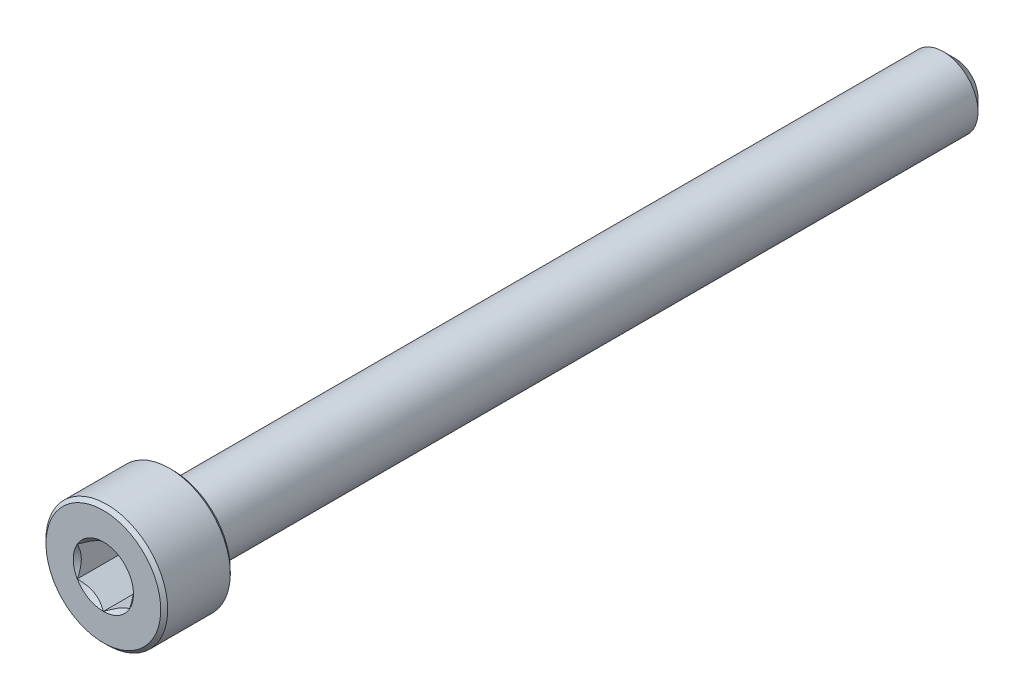
ISO-10303-21;
HEADER;
FILE_DESCRIPTION(('STEP AP214'),'2;1');
FILE_NAME('part.step','',(''),(''),'','','');
FILE_SCHEMA(('AUTOMOTIVE_DESIGN { 1 0 10303 214 1 1 1 1 }'));
ENDSEC;
DATA;
#1=APPLICATION_CONTEXT('core data for automotive mechanical design processes');
#2=APPLICATION_PROTOCOL_DEFINITION('international standard','automotive_design',2000,#1);
#3=PRODUCT_CONTEXT('',#1,'mechanical');
#4=PRODUCT('Part','Part','',(#3));
#5=PRODUCT_RELATED_PRODUCT_CATEGORY('part','',(#4));
#6=PRODUCT_DEFINITION_FORMATION('','',#4);
#7=PRODUCT_DEFINITION_CONTEXT('part definition',#1,'design');
#8=PRODUCT_DEFINITION('design','',#6,#7);
#9=PRODUCT_DEFINITION_SHAPE('','',#8);
#10=(LENGTH_UNIT() NAMED_UNIT(*) SI_UNIT(.MILLI.,.METRE.));
#11=(NAMED_UNIT(*) PLANE_ANGLE_UNIT() SI_UNIT($,.RADIAN.));
#12=(NAMED_UNIT(*) SI_UNIT($,.STERADIAN.) SOLID_ANGLE_UNIT());
#13=UNCERTAINTY_MEASURE_WITH_UNIT(LENGTH_MEASURE(1.E-05),#10,'distance_accuracy_value','');
#14=(GEOMETRIC_REPRESENTATION_CONTEXT(3) GLOBAL_UNCERTAINTY_ASSIGNED_CONTEXT((#13)) GLOBAL_UNIT_ASSIGNED_CONTEXT((#10,
#11,#12)) REPRESENTATION_CONTEXT('',''));
#15=CARTESIAN_POINT('',(0.,0.,0.));
#16=DIRECTION('',(0.,0.,1.));
#17=DIRECTION('',(1.,0.,0.));
#18=AXIS2_PLACEMENT_3D('',#15,#16,#17);
#19=CARTESIAN_POINT('',(0.,0.,24.5));
#20=DIRECTION('',(0.,0.,1.));
#21=DIRECTION('',(0.,-1.,0.));
#22=AXIS2_PLACEMENT_3D('',#19,#20,#21);
#23=PLANE('',#22);
#24=CARTESIAN_POINT('',(0.,0.,24.5));
#25=DIRECTION('',(0.,0.,1.));
#26=DIRECTION('',(1.,0.,0.));
#27=AXIS2_PLACEMENT_3D('',#24,#25,#26);
#28=CIRCLE('',#27,1.73205080756888);
#29=CARTESIAN_POINT('',(0.,-1.73205080756888,24.5));
#30=VERTEX_POINT('',#29);
#31=CARTESIAN_POINT('',(1.5,-0.866025403784438,24.5));
#32=VERTEX_POINT('',#31);
#33=EDGE_CURVE('E106',#30,#32,#28,.T.);
#34=ORIENTED_EDGE('',*,*,#33,.F.);
#35=CARTESIAN_POINT('',(-1.5,-0.866025403784439,24.5));
#36=VERTEX_POINT('',#35);
#37=EDGE_CURVE('E300',#36,#30,#28,.T.);
#38=ORIENTED_EDGE('',*,*,#37,.F.);
#39=CARTESIAN_POINT('',(-1.5,0.86602540378444,24.5));
#40=VERTEX_POINT('',#39);
#41=EDGE_CURVE('E147',#40,#36,#28,.T.);
#42=ORIENTED_EDGE('',*,*,#41,.F.);
#43=CARTESIAN_POINT('',(0.,1.73205080756888,24.5));
#44=VERTEX_POINT('',#43);
#45=EDGE_CURVE('E140',#44,#40,#28,.T.);
#46=ORIENTED_EDGE('',*,*,#45,.F.);
#47=CARTESIAN_POINT('',(1.5,0.86602540378444,24.5));
#48=VERTEX_POINT('',#47);
#49=EDGE_CURVE('E108',#48,#44,#28,.T.);
#50=ORIENTED_EDGE('',*,*,#49,.F.);
#51=EDGE_CURVE('E99',#32,#48,#28,.T.);
#52=ORIENTED_EDGE('',*,*,#51,.F.);
#53=EDGE_LOOP('',(#34,#38,#42,#46,#50,#52));
#54=FACE_BOUND('',#53,.T.);
#55=CARTESIAN_POINT('',(0.,0.,24.5));
#56=DIRECTION('',(0.,0.,-1.));
#57=DIRECTION('',(0.,1.,0.));
#58=AXIS2_PLACEMENT_3D('',#55,#56,#57);
#59=CIRCLE('',#58,3.3);
#60=CARTESIAN_POINT('',(0.,3.3,24.5));
#61=VERTEX_POINT('',#60);
#62=EDGE_CURVE('E55',#61,#61,#59,.T.);
#63=ORIENTED_EDGE('',*,*,#62,.F.);
#64=EDGE_LOOP('',(#63));
#65=FACE_BOUND('',#64,.T.);
#66=ADVANCED_FACE('F41',(#54,#65),#23,.T.);
#67=CARTESIAN_POINT('',(0.,0.,24.3));
#68=DIRECTION('',(0.,0.,-1.));
#69=DIRECTION('',(0.,1.,0.));
#70=AXIS2_PLACEMENT_3D('',#67,#68,#69);
#71=CONICAL_SURFACE('',#70,3.5,0.785398163397452);
#72=ORIENTED_EDGE('',*,*,#62,.T.);
#73=EDGE_LOOP('',(#72));
#74=FACE_BOUND('',#73,.T.);
#75=CARTESIAN_POINT('',(0.,0.,24.3));
#76=DIRECTION('',(0.,0.,-1.));
#77=DIRECTION('',(0.,1.,0.));
#78=AXIS2_PLACEMENT_3D('',#75,#76,#77);
#79=CIRCLE('',#78,3.5);
#80=CARTESIAN_POINT('',(0.,3.5,24.3));
#81=VERTEX_POINT('',#80);
#82=EDGE_CURVE('E233',#81,#81,#79,.T.);
#83=ORIENTED_EDGE('',*,*,#82,.F.);
#84=EDGE_LOOP('',(#83));
#85=FACE_BOUND('',#84,.T.);
#86=ADVANCED_FACE('F221',(#74,#85),#71,.T.);
#87=CARTESIAN_POINT('',(0.,0.,-24.5));
#88=DIRECTION('',(0.,0.,-1.));
#89=DIRECTION('',(0.,1.,0.));
#90=AXIS2_PLACEMENT_3D('',#87,#88,#89);
#91=CYLINDRICAL_SURFACE('',#90,3.5);
#92=ORIENTED_EDGE('',*,*,#82,.T.);
#93=EDGE_LOOP('',(#92));
#94=FACE_BOUND('',#93,.T.);
#95=CARTESIAN_POINT('',(0.,0.,20.7));
#96=DIRECTION('',(0.,0.,-1.));
#97=DIRECTION('',(0.,1.,0.));
#98=AXIS2_PLACEMENT_3D('',#95,#96,#97);
#99=CIRCLE('',#98,3.5);
#100=CARTESIAN_POINT('',(0.,3.5,20.7));
#101=VERTEX_POINT('',#100);
#102=EDGE_CURVE('E235',#101,#101,#99,.T.);
#103=ORIENTED_EDGE('',*,*,#102,.F.);
#104=EDGE_LOOP('',(#103));
#105=FACE_BOUND('',#104,.T.);
#106=ADVANCED_FACE('F218',(#94,#105),#91,.T.);
#107=CARTESIAN_POINT('',(0.,0.,20.5));
#108=DIRECTION('',(0.,0.,1.));
#109=DIRECTION('',(0.,-1.,0.));
#110=AXIS2_PLACEMENT_3D('',#107,#108,#109);
#111=CONICAL_SURFACE('',#110,3.3,0.785398163397434);
#112=ORIENTED_EDGE('',*,*,#102,.T.);
#113=EDGE_LOOP('',(#112));
#114=FACE_BOUND('',#113,.T.);
#115=CARTESIAN_POINT('',(0.,0.,20.5));
#116=DIRECTION('',(0.,0.,-1.));
#117=DIRECTION('',(0.,1.,0.));
#118=AXIS2_PLACEMENT_3D('',#115,#116,#117);
#119=CIRCLE('',#118,3.3);
#120=CARTESIAN_POINT('',(0.,3.3,20.5));
#121=VERTEX_POINT('',#120);
#122=EDGE_CURVE('E240',#121,#121,#119,.T.);
#123=ORIENTED_EDGE('',*,*,#122,.F.);
#124=EDGE_LOOP('',(#123));
#125=FACE_BOUND('',#124,.T.);
#126=ADVANCED_FACE('F214',(#114,#125),#111,.T.);
#127=CARTESIAN_POINT('',(0.,3.3,20.5));
#128=DIRECTION('',(0.,0.,-1.));
#129=DIRECTION('',(0.,1.,0.));
#130=AXIS2_PLACEMENT_3D('',#127,#128,#129);
#131=PLANE('',#130);
#132=ORIENTED_EDGE('',*,*,#122,.T.);
#133=EDGE_LOOP('',(#132));
#134=FACE_BOUND('',#133,.T.);
#135=CARTESIAN_POINT('',(0.,0.,20.5));
#136=DIRECTION('',(0.,0.,-1.));
#137=DIRECTION('',(0.,1.,0.));
#138=AXIS2_PLACEMENT_3D('',#135,#136,#137);
#139=CIRCLE('',#138,2.);
#140=CARTESIAN_POINT('',(0.,2.,20.5));
#141=VERTEX_POINT('',#140);
#142=EDGE_CURVE('E246',#141,#141,#139,.T.);
#143=ORIENTED_EDGE('',*,*,#142,.F.);
#144=EDGE_LOOP('',(#143));
#145=FACE_BOUND('',#144,.T.);
#146=ADVANCED_FACE('F210',(#134,#145),#131,.T.);
#147=CARTESIAN_POINT('',(0.,0.,-24.5));
#148=DIRECTION('',(0.,0.,-1.));
#149=DIRECTION('',(0.,1.,0.));
#150=AXIS2_PLACEMENT_3D('',#147,#148,#149);
#151=CYLINDRICAL_SURFACE('',#150,2.);
#152=ORIENTED_EDGE('',*,*,#142,.T.);
#153=EDGE_LOOP('',(#152));
#154=FACE_BOUND('',#153,.T.);
#155=CARTESIAN_POINT('',(0.,0.,-23.8));
#156=DIRECTION('',(0.,0.,-1.));
#157=DIRECTION('',(0.,1.,0.));
#158=AXIS2_PLACEMENT_3D('',#155,#156,#157);
#159=CIRCLE('',#158,2.);
#160=CARTESIAN_POINT('',(0.,2.,-23.8));
#161=VERTEX_POINT('',#160);
#162=EDGE_CURVE('E250',#161,#161,#159,.T.);
#163=ORIENTED_EDGE('',*,*,#162,.F.);
#164=EDGE_LOOP('',(#163));
#165=FACE_BOUND('',#164,.T.);
#166=ADVANCED_FACE('F206',(#154,#165),#151,.T.);
#167=CARTESIAN_POINT('',(0.,0.,-24.5));
#168=DIRECTION('',(0.,0.,1.));
#169=DIRECTION('',(0.,-1.,0.));
#170=AXIS2_PLACEMENT_3D('',#167,#168,#169);
#171=CONICAL_SURFACE('',#170,1.3,0.785398163397442);
#172=ORIENTED_EDGE('',*,*,#162,.T.);
#173=EDGE_LOOP('',(#172));
#174=FACE_BOUND('',#173,.T.);
#175=CARTESIAN_POINT('',(0.,0.,-24.5));
#176=DIRECTION('',(0.,0.,-1.));
#177=DIRECTION('',(0.,1.,0.));
#178=AXIS2_PLACEMENT_3D('',#175,#176,#177);
#179=CIRCLE('',#178,1.3);
#180=CARTESIAN_POINT('',(0.,1.3,-24.5));
#181=VERTEX_POINT('',#180);
#182=EDGE_CURVE('E254',#181,#181,#179,.T.);
#183=ORIENTED_EDGE('',*,*,#182,.F.);
#184=EDGE_LOOP('',(#183));
#185=FACE_BOUND('',#184,.T.);
#186=ADVANCED_FACE('F202',(#174,#185),#171,.T.);
#187=CARTESIAN_POINT('',(0.,1.3,-24.5));
#188=DIRECTION('',(0.,0.,-1.));
#189=DIRECTION('',(0.,1.,0.));
#190=AXIS2_PLACEMENT_3D('',#187,#188,#189);
#191=PLANE('',#190);
#192=ORIENTED_EDGE('',*,*,#182,.T.);
#193=EDGE_LOOP('',(#192));
#194=FACE_BOUND('',#193,.T.);
#195=ADVANCED_FACE('F199',(#194),#191,.T.);
#196=CARTESIAN_POINT('',(0.,0.,24.5));
#197=DIRECTION('',(0.,0.,1.));
#198=DIRECTION('',(1.,0.,0.));
#199=AXIS2_PLACEMENT_3D('',#196,#197,#198);
#200=CONICAL_SURFACE('',#199,1.73205080756888,0.78539816339745);
#201=ORIENTED_EDGE('',*,*,#33,.T.);
#202=CARTESIAN_POINT('',(-0.000199999999999638,-1.73216627762272,24.5001154816001));
#203=CARTESIAN_POINT('',(0.0513677907370756,-1.70239359975915,24.4703654760673));
#204=CARTESIAN_POINT('',(0.103797917665201,-1.67212305186355,24.4423624839103));
#205=CARTESIAN_POINT('',(0.210709034055597,-1.61039789003619,24.3910892304401));
#206=CARTESIAN_POINT('',(0.265200195814662,-1.57893740312614,24.3678475050444));
#207=CARTESIAN_POINT('',(0.37507908135725,-1.51549879897987,24.3280337289922));
#208=CARTESIAN_POINT('',(0.430438809095201,-1.4835368452681,24.3113615856709));
#209=CARTESIAN_POINT('',(0.542377257477152,-1.41890915196211,24.2856744568181));
#210=CARTESIAN_POINT('',(0.59895255655301,-1.38624538781118,24.2766402904789));
#211=CARTESIAN_POINT('',(0.696455389516442,-1.32995210095299,24.2684890812269));
#212=CARTESIAN_POINT('',(0.737256908280468,-1.30639533311124,24.2672822529892));
#213=CARTESIAN_POINT('',(0.81878796961586,-1.25932335290193,24.2693140571623));
#214=CARTESIAN_POINT('',(0.859517494314631,-1.23580815085313,24.2725536707483));
#215=CARTESIAN_POINT('',(0.940584402163418,-1.18900414978427,24.283291985982));
#216=CARTESIAN_POINT('',(0.98092138459829,-1.16571558211719,24.2907946530187));
#217=CARTESIAN_POINT('',(1.06091833691403,-1.11952932016335,24.3096516119283));
#218=CARTESIAN_POINT('',(1.10057800851621,-1.09663179808786,24.3210075570186));
#219=CARTESIAN_POINT('',(1.20216313477449,-1.03798159809698,24.3547216475927));
#220=CARTESIAN_POINT('',(1.26345855370969,-1.00259267147465,24.3796218490934));
#221=CARTESIAN_POINT('',(1.35358562846331,-0.950557780604374,24.4216566532716));
#222=CARTESIAN_POINT('',(1.38328513990772,-0.933410759677147,24.4364251535591));
#223=CARTESIAN_POINT('',(1.44213790138375,-0.899432101996406,24.4673105659402));
#224=CARTESIAN_POINT('',(1.47129140422064,-0.88260031928571,24.4834268341217));
#225=CARTESIAN_POINT('',(1.5002,-0.865909933730601,24.5001154816001));
#226=B_SPLINE_CURVE_WITH_KNOTS('',3,(#202,#203,#204,#205,#206,#207,#208,#209,#210,#211,#212,
#213,#214,#215,#216,#217,#218,#219,#220,#221,#222,#223,#224,#225),.UNSPECIFIED.,.F.,.F.,(4,2,2,
2,2,2,2,2,2,2,2,4),(0.,0.199829143693305,0.40082298738239,0.598623720538183,0.795926240188891,
0.937113067959883,1.07833105577193,1.21968061668222,1.36109089931055,1.58570969637566,
1.69770705470964,1.80965120737194),.UNSPECIFIED.);
#227=EDGE_CURVE('E12',#30,#32,#226,.T.);
#228=ORIENTED_EDGE('',*,*,#227,.F.);
#229=EDGE_LOOP('',(#201,#228));
#230=FACE_BOUND('',#229,.T.);
#231=ADVANCED_FACE('F165',(#230),#200,.F.);
#232=ORIENTED_EDGE('',*,*,#37,.T.);
#233=CARTESIAN_POINT('',(-1.5002,-0.865909933730601,24.5001154816001));
#234=CARTESIAN_POINT('',(-1.44863220926292,-0.895682611594166,24.4703654760673));
#235=CARTESIAN_POINT('',(-1.3962020823348,-0.925953159489765,24.4423624839103));
#236=CARTESIAN_POINT('',(-1.2892909659444,-0.987678321317124,24.3910892304401));
#237=CARTESIAN_POINT('',(-1.23479980418534,-1.01913880822718,24.3678475050444));
#238=CARTESIAN_POINT('',(-1.12492091864275,-1.08257741237344,24.3280337289922));
#239=CARTESIAN_POINT('',(-1.0695611909048,-1.11453936608522,24.3113615856709));
#240=CARTESIAN_POINT('',(-0.957622742522848,-1.1791670593912,24.2856744568181));
#241=CARTESIAN_POINT('',(-0.90104744344699,-1.21183082354213,24.2766402904789));
#242=CARTESIAN_POINT('',(-0.803544610483557,-1.26812411040032,24.2684890812269));
#243=CARTESIAN_POINT('',(-0.762743091719532,-1.29168087824208,24.2672822529892));
#244=CARTESIAN_POINT('',(-0.681212030384139,-1.33875285845138,24.2693140571623));
#245=CARTESIAN_POINT('',(-0.640482505685368,-1.36226806050018,24.2725536707483));
#246=CARTESIAN_POINT('',(-0.559415597836581,-1.40907206156905,24.283291985982));
#247=CARTESIAN_POINT('',(-0.519078615401709,-1.43236062923612,24.2907946530187));
#248=CARTESIAN_POINT('',(-0.439081663085966,-1.47854689118997,24.3096516119283));
#249=CARTESIAN_POINT('',(-0.399421991483789,-1.50144441326546,24.3210075570186));
#250=CARTESIAN_POINT('',(-0.297836865225513,-1.56009461325633,24.3547216475927));
#251=CARTESIAN_POINT('',(-0.236541446290308,-1.59548353987866,24.3796218490934));
#252=CARTESIAN_POINT('',(-0.146414371536684,-1.64751843074894,24.4216566532716));
#253=CARTESIAN_POINT('',(-0.116714860092281,-1.66466545167617,24.4364251535591));
#254=CARTESIAN_POINT('',(-0.0578620986162482,-1.69864410935691,24.4673105659402));
#255=CARTESIAN_POINT('',(-0.0287085957793622,-1.71547589206761,24.4834268341217));
#256=CARTESIAN_POINT('',(0.000200000000000611,-1.73216627762272,24.5001154816001));
#257=B_SPLINE_CURVE_WITH_KNOTS('',3,(#233,#234,#235,#236,#237,#238,#239,#240,#241,#242,#243,
#244,#245,#246,#247,#248,#249,#250,#251,#252,#253,#254,#255,#256),.UNSPECIFIED.,.F.,.F.,(4,2,2,
2,2,2,2,2,2,2,2,4),(0.,0.199829143693305,0.40082298738239,0.598623720538183,0.795926240188892,
0.937113067959884,1.07833105577193,1.21968061668222,1.36109089931055,1.58570969637566,
1.69770705470964,1.80965120737194),.UNSPECIFIED.);
#258=EDGE_CURVE('E142',#36,#30,#257,.T.);
#259=ORIENTED_EDGE('',*,*,#258,.F.);
#260=EDGE_LOOP('',(#232,#259));
#261=FACE_BOUND('',#260,.T.);
#262=ADVANCED_FACE('F298',(#261),#200,.F.);
#263=ORIENTED_EDGE('',*,*,#41,.T.);
#264=CARTESIAN_POINT('',(-1.5,-1.72720812994822,25.0555785164605));
#265=CARTESIAN_POINT('',(-1.5,-1.68515175723693,25.0238299080399));
#266=CARTESIAN_POINT('',(-1.5,-1.64286104772391,24.9923925939825));
#267=CARTESIAN_POINT('',(-1.5,-1.55771581058238,24.930269087717));
#268=CARTESIAN_POINT('',(-1.5,-1.51486114408249,24.8995830860455));
#269=CARTESIAN_POINT('',(-1.5,-1.38468134170665,24.8084071925586));
#270=CARTESIAN_POINT('',(-1.5,-1.29637976089561,24.7492883435437));
#271=CARTESIAN_POINT('',(-1.5,-1.11121478745132,24.6332309964035));
#272=CARTESIAN_POINT('',(-1.5,-1.01415038251068,24.5766095588047));
#273=CARTESIAN_POINT('',(-1.5,-0.815173408989818,24.4730368813091));
#274=CARTESIAN_POINT('',(-1.5,-0.713278669326363,24.4260530415721));
#275=CARTESIAN_POINT('',(-1.5,-0.560333775001792,24.3685726684515));
#276=CARTESIAN_POINT('',(-1.5,-0.511547983012751,24.3520753877783));
#277=CARTESIAN_POINT('',(-1.5,-0.41279862021383,24.3229975129476));
#278=CARTESIAN_POINT('',(-1.5,-0.362834968520753,24.3104171886138));
#279=CARTESIAN_POINT('',(-1.5,-0.262863235540419,24.2900361941635));
#280=CARTESIAN_POINT('',(-1.5,-0.212872113909477,24.2821536327604));
#281=CARTESIAN_POINT('',(-1.5,-0.112355243682833,24.2713220639777));
#282=CARTESIAN_POINT('',(-1.5,-0.0618295884917323,24.2683722085294));
#283=CARTESIAN_POINT('',(-1.5,0.0374291732025481,24.2676248577218));
#284=CARTESIAN_POINT('',(-1.5,0.0861609670655328,24.2696447335505));
#285=CARTESIAN_POINT('',(-1.5,0.183206937624694,24.2783225528794));
#286=CARTESIAN_POINT('',(-1.5,0.231521073289699,24.2849809469459));
#287=CARTESIAN_POINT('',(-1.5,0.328199853268107,24.302685244089));
#288=CARTESIAN_POINT('',(-1.5,0.37655061614869,24.3138058112177));
#289=CARTESIAN_POINT('',(-1.5,0.472195696955759,24.3398434139978));
#290=CARTESIAN_POINT('',(-1.5,0.519490102919008,24.3547601319841));
#291=CARTESIAN_POINT('',(-1.5,0.668391282485062,24.4073352235115));
#292=CARTESIAN_POINT('',(-1.5,0.76787870926495,24.4509812873618));
#293=CARTESIAN_POINT('',(-1.5,0.962179866385499,24.5480229944291));
#294=CARTESIAN_POINT('',(-1.5,1.05697519927965,24.6014536648971));
#295=CARTESIAN_POINT('',(-1.5,1.23814273494588,24.7116858517578));
#296=CARTESIAN_POINT('',(-1.5,1.32469942140117,24.7681879204262));
#297=CARTESIAN_POINT('',(-1.5,1.45222331245985,24.8555343012678));
#298=CARTESIAN_POINT('',(-1.5,1.49418091932912,24.8849577583565));
#299=CARTESIAN_POINT('',(-1.5,1.5775227288333,24.9445828214816));
#300=CARTESIAN_POINT('',(-1.5,1.6189070859806,24.9747842113029));
#301=CARTESIAN_POINT('',(-1.5,1.66005277969054,25.0053081782352));
#302=B_SPLINE_CURVE_WITH_KNOTS('',3,(#264,#265,#266,#267,#268,#269,#270,#271,#272,#273,#274,
#275,#276,#277,#278,#279,#280,#281,#282,#283,#284,#285,#286,#287,#288,#289,#290,#291,#292,#293,
#294,#295,#296,#297,#298,#299,#300,#301),.UNSPECIFIED.,.F.,.F.,(4,2,2,2,2,2,2,2,2,2,2,2,2,2,2,2,
2,2,4),(0.,0.158079549012754,0.316198781054126,0.634850417468459,0.971690311551775,
1.30737131686505,1.46173961151183,1.61611853763032,1.76772101442094,1.91929742387554,
2.06538741227088,2.21149159321503,2.36014984648184,2.50879566399376,2.83376031423511,
3.15991186974582,3.4698560178094,3.62358896013691,3.77727962610764),.UNSPECIFIED.);
#303=EDGE_CURVE('E145',#40,#36,#302,.F.);
#304=ORIENTED_EDGE('',*,*,#303,.F.);
#305=EDGE_LOOP('',(#263,#304));
#306=FACE_BOUND('',#305,.T.);
#307=ADVANCED_FACE('F303',(#306),#200,.F.);
#308=ORIENTED_EDGE('',*,*,#45,.T.);
#309=CARTESIAN_POINT('',(0.00019999999999983,1.73216627762272,24.5001154816001));
#310=CARTESIAN_POINT('',(-0.0513677907370756,1.70239359975915,24.4703654760673));
#311=CARTESIAN_POINT('',(-0.103797917665201,1.67212305186355,24.4423624839103));
#312=CARTESIAN_POINT('',(-0.210709034055597,1.61039789003619,24.3910892304401));
#313=CARTESIAN_POINT('',(-0.265200195814662,1.57893740312614,24.3678475050444));
#314=CARTESIAN_POINT('',(-0.37507908135725,1.51549879897987,24.3280337289922));
#315=CARTESIAN_POINT('',(-0.430438809095202,1.4835368452681,24.3113615856709));
#316=CARTESIAN_POINT('',(-0.542377257477153,1.41890915196211,24.2856744568181));
#317=CARTESIAN_POINT('',(-0.598952556553012,1.38624538781118,24.2766402904789));
#318=CARTESIAN_POINT('',(-0.696455389516444,1.32995210095299,24.2684890812269));
#319=CARTESIAN_POINT('',(-0.73725690828047,1.30639533311124,24.2672822529892));
#320=CARTESIAN_POINT('',(-0.818787969615862,1.25932335290193,24.2693140571623));
#321=CARTESIAN_POINT('',(-0.859517494314633,1.23580815085313,24.2725536707483));
#322=CARTESIAN_POINT('',(-0.940584402163419,1.18900414978426,24.283291985982));
#323=CARTESIAN_POINT('',(-0.980921384598292,1.16571558211719,24.2907946530187));
#324=CARTESIAN_POINT('',(-1.06091833691403,1.11952932016335,24.3096516119283));
#325=CARTESIAN_POINT('',(-1.10057800851621,1.09663179808786,24.3210075570186));
#326=CARTESIAN_POINT('',(-1.20216313477449,1.03798159809698,24.3547216475927));
#327=CARTESIAN_POINT('',(-1.26345855370969,1.00259267147465,24.3796218490934));
#328=CARTESIAN_POINT('',(-1.35358562846332,0.950557780604373,24.4216566532716));
#329=CARTESIAN_POINT('',(-1.38328513990772,0.933410759677146,24.4364251535591));
#330=CARTESIAN_POINT('',(-1.44213790138375,0.899432101996406,24.4673105659402));
#331=CARTESIAN_POINT('',(-1.47129140422064,0.882600319285709,24.4834268341217));
#332=CARTESIAN_POINT('',(-1.5002,0.865909933730601,24.5001154816001));
#333=B_SPLINE_CURVE_WITH_KNOTS('',3,(#309,#310,#311,#312,#313,#314,#315,#316,#317,#318,#319,
#320,#321,#322,#323,#324,#325,#326,#327,#328,#329,#330,#331,#332),.UNSPECIFIED.,.F.,.F.,(4,2,2,
2,2,2,2,2,2,2,2,4),(0.,0.199829143693306,0.400822987382391,0.598623720538184,0.795926240188893,
0.937113067959886,1.07833105577193,1.21968061668222,1.36109089931055,1.58570969637566,
1.69770705470964,1.80965120737194),.UNSPECIFIED.);
#334=EDGE_CURVE('E119',#44,#40,#333,.T.);
#335=ORIENTED_EDGE('',*,*,#334,.F.);
#336=EDGE_LOOP('',(#308,#335));
#337=FACE_BOUND('',#336,.T.);
#338=ADVANCED_FACE('F342',(#337),#200,.F.);
#339=ORIENTED_EDGE('',*,*,#49,.T.);
#340=CARTESIAN_POINT('',(1.5002,0.865909933730601,24.5001154816001));
#341=CARTESIAN_POINT('',(1.44863220926292,0.895682611594166,24.4703654760673));
#342=CARTESIAN_POINT('',(1.3962020823348,0.925953159489765,24.4423624839103));
#343=CARTESIAN_POINT('',(1.2892909659444,0.987678321317124,24.3910892304401));
#344=CARTESIAN_POINT('',(1.23479980418534,1.01913880822718,24.3678475050444));
#345=CARTESIAN_POINT('',(1.12492091864275,1.08257741237344,24.3280337289922));
#346=CARTESIAN_POINT('',(1.0695611909048,1.11453936608521,24.3113615856709));
#347=CARTESIAN_POINT('',(0.957622742522848,1.1791670593912,24.2856744568181));
#348=CARTESIAN_POINT('',(0.90104744344699,1.21183082354213,24.2766402904789));
#349=CARTESIAN_POINT('',(0.803544610483558,1.26812411040032,24.2684890812269));
#350=CARTESIAN_POINT('',(0.762743091719532,1.29168087824208,24.2672822529892));
#351=CARTESIAN_POINT('',(0.68121203038414,1.33875285845138,24.2693140571623));
#352=CARTESIAN_POINT('',(0.640482505685368,1.36226806050018,24.2725536707483));
#353=CARTESIAN_POINT('',(0.559415597836582,1.40907206156905,24.283291985982));
#354=CARTESIAN_POINT('',(0.519078615401709,1.43236062923612,24.2907946530187));
#355=CARTESIAN_POINT('',(0.439081663085967,1.47854689118997,24.3096516119283));
#356=CARTESIAN_POINT('',(0.39942199148379,1.50144441326545,24.3210075570186));
#357=CARTESIAN_POINT('',(0.297836865225513,1.56009461325633,24.3547216475927));
#358=CARTESIAN_POINT('',(0.236541446290309,1.59548353987866,24.3796218490934));
#359=CARTESIAN_POINT('',(0.146414371536684,1.64751843074894,24.4216566532716));
#360=CARTESIAN_POINT('',(0.11671486009228,1.66466545167617,24.4364251535591));
#361=CARTESIAN_POINT('',(0.0578620986162474,1.69864410935691,24.4673105659402));
#362=CARTESIAN_POINT('',(0.0287085957793617,1.71547589206761,24.4834268341217));
#363=CARTESIAN_POINT('',(-0.000200000000000509,1.73216627762272,24.5001154816001));
#364=B_SPLINE_CURVE_WITH_KNOTS('',3,(#340,#341,#342,#343,#344,#345,#346,#347,#348,#349,#350,
#351,#352,#353,#354,#355,#356,#357,#358,#359,#360,#361,#362,#363),.UNSPECIFIED.,.F.,.F.,(4,2,2,
2,2,2,2,2,2,2,2,4),(0.,0.199829143693305,0.40082298738239,0.598623720538183,0.795926240188891,
0.937113067959883,1.07833105577193,1.21968061668222,1.36109089931055,1.58570969637566,
1.69770705470964,1.80965120737194),.UNSPECIFIED.);
#365=EDGE_CURVE('E111',#48,#44,#364,.T.);
#366=ORIENTED_EDGE('',*,*,#365,.F.);
#367=EDGE_LOOP('',(#339,#366));
#368=FACE_BOUND('',#367,.T.);
#369=ADVANCED_FACE('F112',(#368),#200,.F.);
#370=ORIENTED_EDGE('',*,*,#51,.T.);
#371=CARTESIAN_POINT('',(1.5,-1.72720812969692,25.0555785162708));
#372=CARTESIAN_POINT('',(1.5,-1.68515175699267,25.0238299078574));
#373=CARTESIAN_POINT('',(1.5,-1.64286104748673,24.9923925938074));
#374=CARTESIAN_POINT('',(1.5,-1.55771581035941,24.9302690875564));
#375=CARTESIAN_POINT('',(1.5,-1.51486114386668,24.8995830858922));
#376=CARTESIAN_POINT('',(1.5,-1.3846813415127,24.8084071924272));
#377=CARTESIAN_POINT('',(1.5,-1.29637976071653,24.7492883434268));
#378=CARTESIAN_POINT('',(1.5,-1.11121478730467,24.6332309963165));
#379=CARTESIAN_POINT('',(1.5,-1.01415038238167,24.576609558733));
#380=CARTESIAN_POINT('',(1.5,-0.815173408897604,24.4730368812657));
#381=CARTESIAN_POINT('',(1.5,-0.713278669253284,24.4260530415417));
#382=CARTESIAN_POINT('',(1.5,-0.560333774943111,24.3685726684308));
#383=CARTESIAN_POINT('',(1.5,-0.511547982948041,24.3520753877572));
#384=CARTESIAN_POINT('',(1.5,-0.412798620136866,24.322997512927));
#385=CARTESIAN_POINT('',(1.5,-0.362834968437562,24.310417188594));
#386=CARTESIAN_POINT('',(1.5,-0.262863235444981,24.2900361941468));
#387=CARTESIAN_POINT('',(1.5,-0.212872113808021,24.282153632746));
#388=CARTESIAN_POINT('',(1.5,-0.112355243569543,24.271322063969));
#389=CARTESIAN_POINT('',(1.5,-0.0618295883726257,24.2683722085244));
#390=CARTESIAN_POINT('',(1.5,0.0374291733323864,24.2676248577249));
#391=CARTESIAN_POINT('',(1.5,0.0861609672003011,24.2696447335581));
#392=CARTESIAN_POINT('',(1.5,0.183206937768829,24.2783225528968));
#393=CARTESIAN_POINT('',(1.5,0.231521073438271,24.2849809469685));
#394=CARTESIAN_POINT('',(1.5,0.328199853425437,24.3026852441226));
#395=CARTESIAN_POINT('',(1.5,0.37655061631033,24.313805811257));
#396=CARTESIAN_POINT('',(1.5,0.472195697125599,24.3398434140487));
#397=CARTESIAN_POINT('',(1.5,0.519490103092741,24.3547601320409));
#398=CARTESIAN_POINT('',(1.5,0.668391282696624,24.4073352235961));
#399=CARTESIAN_POINT('',(1.5,0.767878709508552,24.450981287472));
#400=CARTESIAN_POINT('',(1.5,0.962179866690723,24.5480229945931));
#401=CARTESIAN_POINT('',(1.5,1.05697519961444,24.6014536650895));
#402=CARTESIAN_POINT('',(1.5,1.23814273533383,24.7116858520046));
#403=CARTESIAN_POINT('',(1.5,1.3246994218129,24.7681879206986));
#404=CARTESIAN_POINT('',(1.5,1.45222331290673,24.8555343015787));
#405=CARTESIAN_POINT('',(1.5,1.49418091978756,24.88495775868));
#406=CARTESIAN_POINT('',(1.5,1.57752272931476,24.9445828218305));
#407=CARTESIAN_POINT('',(1.5,1.61890708647354,24.9747842116644));
#408=CARTESIAN_POINT('',(1.5,1.66005278019494,25.0053081786095));
#409=B_SPLINE_CURVE_WITH_KNOTS('',3,(#371,#372,#373,#374,#375,#376,#377,#378,#379,#380,#381,
#382,#383,#384,#385,#386,#387,#388,#389,#390,#391,#392,#393,#394,#395,#396,#397,#398,#399,#400,
#401,#402,#403,#404,#405,#406,#407,#408),.UNSPECIFIED.,.F.,.F.,(4,2,2,2,2,2,2,2,2,2,2,2,2,2,2,2,
2,2,4),(0.,0.15807954898267,0.316198780993941,0.634850417346955,0.971690311361506,
1.30737131660666,1.46173961127088,1.61611853740677,1.76772101421409,1.91929742368538,
2.065387412096,2.21149159305544,2.36014984633872,2.50879566386709,2.83376031422673,
3.15991186985651,3.46985601802197,3.62358896039973,3.7772796264207),.UNSPECIFIED.);
#410=EDGE_CURVE('E61',#32,#48,#409,.T.);
#411=ORIENTED_EDGE('',*,*,#410,.F.);
#412=EDGE_LOOP('',(#370,#411));
#413=FACE_BOUND('',#412,.T.);
#414=ADVANCED_FACE('F101',(#413),#200,.F.);
#415=CARTESIAN_POINT('',(0.,3.3,21.5));
#416=DIRECTION('',(0.,0.,-1.));
#417=DIRECTION('',(0.,1.,0.));
#418=AXIS2_PLACEMENT_3D('',#415,#416,#417);
#419=PLANE('',#418);
#420=DIRECTION('',(0.866025403784438,0.5,0.));
#421=VECTOR('',#420,1.);
#422=CARTESIAN_POINT('',(0.,-1.73205080756888,21.5));
#423=LINE('',#422,#421);
#424=CARTESIAN_POINT('',(0.,-1.73205080756888,21.5));
#425=VERTEX_POINT('',#424);
#426=CARTESIAN_POINT('',(1.5,-0.866025403784438,21.5));
#427=VERTEX_POINT('',#426);
#428=EDGE_CURVE('E259',#425,#427,#423,.T.);
#429=ORIENTED_EDGE('',*,*,#428,.T.);
#430=DIRECTION('',(0.,1.,0.));
#431=VECTOR('',#430,1.);
#432=CARTESIAN_POINT('',(1.5,-0.866025403784438,21.5));
#433=LINE('',#432,#431);
#434=CARTESIAN_POINT('',(1.5,0.866025403784439,21.5));
#435=VERTEX_POINT('',#434);
#436=EDGE_CURVE('E130',#427,#435,#433,.T.);
#437=ORIENTED_EDGE('',*,*,#436,.T.);
#438=DIRECTION('',(-0.866025403784439,0.5,0.));
#439=VECTOR('',#438,1.);
#440=CARTESIAN_POINT('',(1.5,0.866025403784439,21.5));
#441=LINE('',#440,#439);
#442=CARTESIAN_POINT('',(0.,1.73205080756888,21.5));
#443=VERTEX_POINT('',#442);
#444=EDGE_CURVE('E134',#435,#443,#441,.T.);
#445=ORIENTED_EDGE('',*,*,#444,.T.);
#446=DIRECTION('',(-0.866025403784438,-0.5,0.));
#447=VECTOR('',#446,1.);
#448=CARTESIAN_POINT('',(0.,1.73205080756888,21.5));
#449=LINE('',#448,#447);
#450=CARTESIAN_POINT('',(-1.5,0.866025403784439,21.5));
#451=VERTEX_POINT('',#450);
#452=EDGE_CURVE('E264',#443,#451,#449,.T.);
#453=ORIENTED_EDGE('',*,*,#452,.T.);
#454=DIRECTION('',(0.,-1.,0.));
#455=VECTOR('',#454,1.);
#456=CARTESIAN_POINT('',(-1.5,0.866025403784438,21.5));
#457=LINE('',#456,#455);
#458=CARTESIAN_POINT('',(-1.5,-0.866025403784439,21.5));
#459=VERTEX_POINT('',#458);
#460=EDGE_CURVE('E269',#451,#459,#457,.T.);
#461=ORIENTED_EDGE('',*,*,#460,.T.);
#462=DIRECTION('',(0.866025403784439,-0.5,0.));
#463=VECTOR('',#462,1.);
#464=CARTESIAN_POINT('',(-1.5,-0.866025403784439,21.5));
#465=LINE('',#464,#463);
#466=EDGE_CURVE('E272',#459,#425,#465,.T.);
#467=ORIENTED_EDGE('',*,*,#466,.T.);
#468=EDGE_LOOP('',(#429,#437,#445,#453,#461,#467));
#469=FACE_BOUND('',#468,.T.);
#470=ADVANCED_FACE('F164',(#469),#419,.F.);
#471=CARTESIAN_POINT('',(0.,-1.73205080756888,15.9174243050442));
#472=DIRECTION('',(0.5,-0.866025403784438,0.));
#473=DIRECTION('',(0.866025403784438,0.5,0.));
#474=AXIS2_PLACEMENT_3D('',#471,#472,#473);
#475=PLANE('',#474);
#476=DIRECTION('',(0.,0.,1.));
#477=VECTOR('',#476,1.);
#478=CARTESIAN_POINT('',(0.,-1.73205080756888,15.9174243050442));
#479=LINE('',#478,#477);
#480=EDGE_CURVE('E273',#425,#30,#479,.T.);
#481=ORIENTED_EDGE('',*,*,#480,.T.);
#482=ORIENTED_EDGE('',*,*,#227,.T.);
#483=DIRECTION('',(0.,0.,1.));
#484=VECTOR('',#483,1.);
#485=CARTESIAN_POINT('',(1.5,-0.866025403784438,15.9174243050442));
#486=LINE('',#485,#484);
#487=EDGE_CURVE('E128',#427,#32,#486,.T.);
#488=ORIENTED_EDGE('',*,*,#487,.F.);
#489=ORIENTED_EDGE('',*,*,#428,.F.);
#490=EDGE_LOOP('',(#481,#482,#488,#489));
#491=FACE_BOUND('',#490,.T.);
#492=ADVANCED_FACE('F166',(#491),#475,.F.);
#493=CARTESIAN_POINT('',(-1.5,-0.866025403784439,15.9174243050442));
#494=DIRECTION('',(-0.5,-0.866025403784439,0.));
#495=DIRECTION('',(0.866025403784439,-0.5,0.));
#496=AXIS2_PLACEMENT_3D('',#493,#494,#495);
#497=PLANE('',#496);
#498=DIRECTION('',(0.,0.,1.));
#499=VECTOR('',#498,1.);
#500=CARTESIAN_POINT('',(-1.5,-0.866025403784439,15.9174243050442));
#501=LINE('',#500,#499);
#502=EDGE_CURVE('E69',#459,#36,#501,.T.);
#503=ORIENTED_EDGE('',*,*,#502,.T.);
#504=ORIENTED_EDGE('',*,*,#258,.T.);
#505=ORIENTED_EDGE('',*,*,#480,.F.);
#506=ORIENTED_EDGE('',*,*,#466,.F.);
#507=EDGE_LOOP('',(#503,#504,#505,#506));
#508=FACE_BOUND('',#507,.T.);
#509=ADVANCED_FACE('F160',(#508),#497,.F.);
#510=CARTESIAN_POINT('',(-1.5,0.866025403784438,15.9174243050442));
#511=DIRECTION('',(-1.,0.,0.));
#512=DIRECTION('',(0.,-1.,0.));
#513=AXIS2_PLACEMENT_3D('',#510,#511,#512);
#514=PLANE('',#513);
#515=DIRECTION('',(0.,0.,1.));
#516=VECTOR('',#515,1.);
#517=CARTESIAN_POINT('',(-1.5,0.866025403784438,15.9174243050442));
#518=LINE('',#517,#516);
#519=EDGE_CURVE('E265',#451,#40,#518,.T.);
#520=ORIENTED_EDGE('',*,*,#519,.T.);
#521=ORIENTED_EDGE('',*,*,#303,.T.);
#522=ORIENTED_EDGE('',*,*,#502,.F.);
#523=ORIENTED_EDGE('',*,*,#460,.F.);
#524=EDGE_LOOP('',(#520,#521,#522,#523));
#525=FACE_BOUND('',#524,.T.);
#526=ADVANCED_FACE('F314',(#525),#514,.F.);
#527=CARTESIAN_POINT('',(0.,1.73205080756888,15.9174243050442));
#528=DIRECTION('',(-0.5,0.866025403784438,0.));
#529=DIRECTION('',(-0.866025403784438,-0.5,0.));
#530=AXIS2_PLACEMENT_3D('',#527,#528,#529);
#531=PLANE('',#530);
#532=DIRECTION('',(0.,0.,1.));
#533=VECTOR('',#532,1.);
#534=CARTESIAN_POINT('',(0.,1.73205080756888,15.9174243050442));
#535=LINE('',#534,#533);
#536=EDGE_CURVE('E261',#443,#44,#535,.T.);
#537=ORIENTED_EDGE('',*,*,#536,.T.);
#538=ORIENTED_EDGE('',*,*,#334,.T.);
#539=ORIENTED_EDGE('',*,*,#519,.F.);
#540=ORIENTED_EDGE('',*,*,#452,.F.);
#541=EDGE_LOOP('',(#537,#538,#539,#540));
#542=FACE_BOUND('',#541,.T.);
#543=ADVANCED_FACE('F191',(#542),#531,.F.);
#544=CARTESIAN_POINT('',(1.5,0.866025403784439,15.9174243050442));
#545=DIRECTION('',(0.5,0.866025403784439,0.));
#546=DIRECTION('',(-0.866025403784439,0.5,0.));
#547=AXIS2_PLACEMENT_3D('',#544,#545,#546);
#548=PLANE('',#547);
#549=DIRECTION('',(0.,0.,1.));
#550=VECTOR('',#549,1.);
#551=CARTESIAN_POINT('',(1.5,0.866025403784439,15.9174243050442));
#552=LINE('',#551,#550);
#553=EDGE_CURVE('E125',#435,#48,#552,.T.);
#554=ORIENTED_EDGE('',*,*,#553,.T.);
#555=ORIENTED_EDGE('',*,*,#365,.T.);
#556=ORIENTED_EDGE('',*,*,#536,.F.);
#557=ORIENTED_EDGE('',*,*,#444,.F.);
#558=EDGE_LOOP('',(#554,#555,#556,#557));
#559=FACE_BOUND('',#558,.T.);
#560=ADVANCED_FACE('F132',(#559),#548,.F.);
#561=CARTESIAN_POINT('',(1.5,-0.866025403784438,15.9174243050442));
#562=DIRECTION('',(1.,0.,0.));
#563=DIRECTION('',(0.,0.,-1.));
#564=AXIS2_PLACEMENT_3D('',#561,#562,#563);
#565=PLANE('',#564);
#566=ORIENTED_EDGE('',*,*,#487,.T.);
#567=ORIENTED_EDGE('',*,*,#410,.T.);
#568=ORIENTED_EDGE('',*,*,#553,.F.);
#569=ORIENTED_EDGE('',*,*,#436,.F.);
#570=EDGE_LOOP('',(#566,#567,#568,#569));
#571=FACE_BOUND('',#570,.T.);
#572=ADVANCED_FACE('F124',(#571),#565,.F.);
#573=CLOSED_SHELL('',(#66,#86,#106,#126,#146,#166,#186,#195,#231,#262,#307,#338,#369,#414,#470,
#492,#509,#526,#543,#560,#572));
#574=MANIFOLD_SOLID_BREP('B2',#573);
#575=ADVANCED_BREP_SHAPE_REPRESENTATION('',(#18,#574),#14);
#576=SHAPE_DEFINITION_REPRESENTATION(#9,#575);
ENDSEC;
END-ISO-10303-21;
